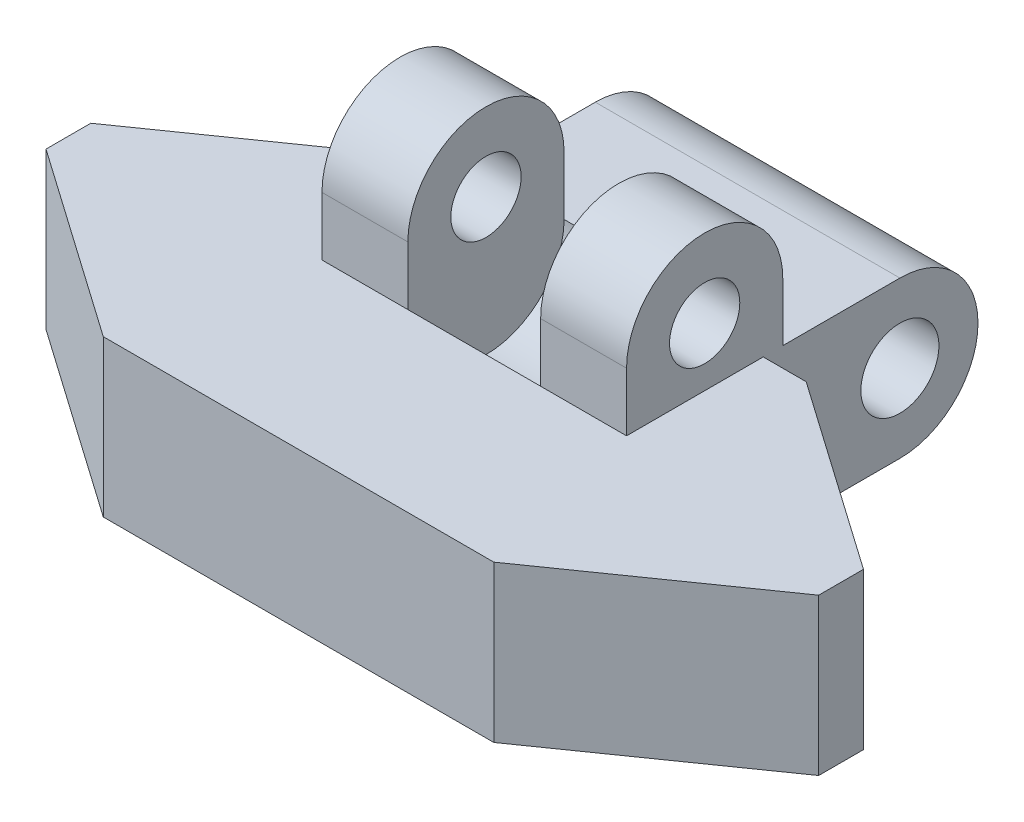
ISO-10303-21;
HEADER;
FILE_DESCRIPTION(('STEP AP214'),'2;1');
FILE_NAME('part.step','',(''),(''),'','','');
FILE_SCHEMA(('AUTOMOTIVE_DESIGN { 1 0 10303 214 1 1 1 1 }'));
ENDSEC;
DATA;
#1=APPLICATION_CONTEXT('core data for automotive mechanical design processes');
#2=APPLICATION_PROTOCOL_DEFINITION('international standard','automotive_design',2000,#1);
#3=PRODUCT_CONTEXT('',#1,'mechanical');
#4=PRODUCT('Part','Part','',(#3));
#5=PRODUCT_RELATED_PRODUCT_CATEGORY('part','',(#4));
#6=PRODUCT_DEFINITION_FORMATION('','',#4);
#7=PRODUCT_DEFINITION_CONTEXT('part definition',#1,'design');
#8=PRODUCT_DEFINITION('design','',#6,#7);
#9=PRODUCT_DEFINITION_SHAPE('','',#8);
#10=(LENGTH_UNIT() NAMED_UNIT(*) SI_UNIT(.MILLI.,.METRE.));
#11=(NAMED_UNIT(*) PLANE_ANGLE_UNIT() SI_UNIT($,.RADIAN.));
#12=(NAMED_UNIT(*) SI_UNIT($,.STERADIAN.) SOLID_ANGLE_UNIT());
#13=UNCERTAINTY_MEASURE_WITH_UNIT(LENGTH_MEASURE(1.E-05),#10,'distance_accuracy_value','');
#14=(GEOMETRIC_REPRESENTATION_CONTEXT(3) GLOBAL_UNCERTAINTY_ASSIGNED_CONTEXT((#13)) GLOBAL_UNIT_ASSIGNED_CONTEXT((#10,
#11,#12)) REPRESENTATION_CONTEXT('',''));
#15=CARTESIAN_POINT('',(0.,0.,0.));
#16=DIRECTION('',(0.,0.,1.));
#17=DIRECTION('',(1.,0.,0.));
#18=AXIS2_PLACEMENT_3D('',#15,#16,#17);
#19=CARTESIAN_POINT('',(0.,4.,0.));
#20=DIRECTION('',(0.,1.,0.));
#21=DIRECTION('',(0.,0.,1.));
#22=AXIS2_PLACEMENT_3D('',#19,#20,#21);
#23=PLANE('',#22);
#24=DIRECTION('',(1.,0.,0.));
#25=VECTOR('',#24,1.);
#26=CARTESIAN_POINT('',(-3.9,4.,-0.500000000000001));
#27=LINE('',#26,#25);
#28=CARTESIAN_POINT('',(1.7,4.,-0.500000000000001));
#29=VERTEX_POINT('',#28);
#30=CARTESIAN_POINT('',(3.9,4.,-0.500000000000001));
#31=VERTEX_POINT('',#30);
#32=EDGE_CURVE('E239',#29,#31,#27,.T.);
#33=ORIENTED_EDGE('',*,*,#32,.F.);
#34=DIRECTION('',(1.,0.,0.));
#35=VECTOR('',#34,1.);
#36=CARTESIAN_POINT('',(-6.17213595499958,4.,-0.5));
#37=LINE('',#36,#35);
#38=CARTESIAN_POINT('',(-1.7,4.,-0.5));
#39=VERTEX_POINT('',#38);
#40=EDGE_CURVE('E308',#39,#29,#37,.T.);
#41=ORIENTED_EDGE('',*,*,#40,.F.);
#42=CARTESIAN_POINT('',(-3.9,4.,-0.500000000000001));
#43=VERTEX_POINT('',#42);
#44=EDGE_CURVE('E235',#43,#39,#27,.T.);
#45=ORIENTED_EDGE('',*,*,#44,.F.);
#46=DIRECTION('',(0.,0.,-1.));
#47=VECTOR('',#46,1.);
#48=CARTESIAN_POINT('',(-3.9,4.,-0.500000000000001));
#49=LINE('',#48,#47);
#50=CARTESIAN_POINT('',(-3.9,4.,-4.));
#51=VERTEX_POINT('',#50);
#52=EDGE_CURVE('E256',#43,#51,#49,.T.);
#53=ORIENTED_EDGE('',*,*,#52,.T.);
#54=DIRECTION('',(-1.,0.,0.));
#55=VECTOR('',#54,1.);
#56=CARTESIAN_POINT('',(-5.,4.,-4.));
#57=LINE('',#56,#55);
#58=CARTESIAN_POINT('',(-5.,4.,-4.));
#59=VERTEX_POINT('',#58);
#60=EDGE_CURVE('E63',#51,#59,#57,.T.);
#61=ORIENTED_EDGE('',*,*,#60,.T.);
#62=DIRECTION('',(-0.819152044288995,0.,0.573576436351041));
#63=VECTOR('',#62,1.);
#64=CARTESIAN_POINT('',(-9.89343998267953,4.,-0.573576436351043));
#65=LINE('',#64,#63);
#66=CARTESIAN_POINT('',(-9.89343998267953,4.,-0.573576436351043));
#67=VERTEX_POINT('',#66);
#68=EDGE_CURVE('E169',#59,#67,#65,.T.);
#69=ORIENTED_EDGE('',*,*,#68,.T.);
#70=DIRECTION('',(0.,0.,1.));
#71=VECTOR('',#70,1.);
#72=CARTESIAN_POINT('',(-9.89343998267953,4.,0.573576436351038));
#73=LINE('',#72,#71);
#74=CARTESIAN_POINT('',(-9.89343998267953,4.,0.573576436351038));
#75=VERTEX_POINT('',#74);
#76=EDGE_CURVE('E104',#67,#75,#73,.T.);
#77=ORIENTED_EDGE('',*,*,#76,.T.);
#78=DIRECTION('',(0.819152044288995,0.,0.573576436351041));
#79=VECTOR('',#78,1.);
#80=CARTESIAN_POINT('',(-9.89343998267953,4.,0.573576436351038));
#81=LINE('',#80,#79);
#82=CARTESIAN_POINT('',(-5.,4.,4.));
#83=VERTEX_POINT('',#82);
#84=EDGE_CURVE('E184',#75,#83,#81,.T.);
#85=ORIENTED_EDGE('',*,*,#84,.T.);
#86=DIRECTION('',(1.,0.,0.));
#87=VECTOR('',#86,1.);
#88=CARTESIAN_POINT('',(-5.,4.,4.));
#89=LINE('',#88,#87);
#90=CARTESIAN_POINT('',(5.,4.,4.));
#91=VERTEX_POINT('',#90);
#92=EDGE_CURVE('E196',#83,#91,#89,.T.);
#93=ORIENTED_EDGE('',*,*,#92,.T.);
#94=DIRECTION('',(0.819152044288995,0.,-0.573576436351041));
#95=VECTOR('',#94,1.);
#96=CARTESIAN_POINT('',(9.89343998267953,4.,0.573576436351038));
#97=LINE('',#96,#95);
#98=CARTESIAN_POINT('',(9.89343998267953,4.,0.573576436351038));
#99=VERTEX_POINT('',#98);
#100=EDGE_CURVE('E127',#91,#99,#97,.T.);
#101=ORIENTED_EDGE('',*,*,#100,.T.);
#102=DIRECTION('',(0.,0.,-1.));
#103=VECTOR('',#102,1.);
#104=CARTESIAN_POINT('',(9.89343998267953,4.,-0.573576436351043));
#105=LINE('',#104,#103);
#106=CARTESIAN_POINT('',(9.89343998267953,4.,-0.573576436351043));
#107=VERTEX_POINT('',#106);
#108=EDGE_CURVE('E119',#99,#107,#105,.T.);
#109=ORIENTED_EDGE('',*,*,#108,.T.);
#110=DIRECTION('',(-0.819152044288995,0.,-0.573576436351041));
#111=VECTOR('',#110,1.);
#112=CARTESIAN_POINT('',(9.89343998267953,4.,-0.573576436351043));
#113=LINE('',#112,#111);
#114=CARTESIAN_POINT('',(5.,4.,-4.));
#115=VERTEX_POINT('',#114);
#116=EDGE_CURVE('E124',#107,#115,#113,.T.);
#117=ORIENTED_EDGE('',*,*,#116,.T.);
#118=CARTESIAN_POINT('',(3.9,4.,-4.));
#119=VERTEX_POINT('',#118);
#120=EDGE_CURVE('E146',#115,#119,#57,.T.);
#121=ORIENTED_EDGE('',*,*,#120,.T.);
#122=DIRECTION('',(0.,0.,-1.));
#123=VECTOR('',#122,1.);
#124=CARTESIAN_POINT('',(3.9,4.,-0.500000000000001));
#125=LINE('',#124,#123);
#126=EDGE_CURVE('E270',#31,#119,#125,.T.);
#127=ORIENTED_EDGE('',*,*,#126,.F.);
#128=EDGE_LOOP('',(#33,#41,#45,#53,#61,#69,#77,#85,#93,#101,#109,#117,#121,#127));
#129=FACE_BOUND('',#128,.T.);
#130=ADVANCED_FACE('F39',(#129),#23,.T.);
#131=DIRECTION('',(1.,0.,0.));
#132=VECTOR('',#131,1.);
#133=CARTESIAN_POINT('',(-3.9,4.,-4.5));
#134=LINE('',#133,#132);
#135=CARTESIAN_POINT('',(-3.9,4.,-4.5));
#136=VERTEX_POINT('',#135);
#137=CARTESIAN_POINT('',(-1.7,4.,-4.5));
#138=VERTEX_POINT('',#137);
#139=EDGE_CURVE('E240',#136,#138,#134,.T.);
#140=ORIENTED_EDGE('',*,*,#139,.T.);
#141=DIRECTION('',(1.,0.,0.));
#142=VECTOR('',#141,1.);
#143=CARTESIAN_POINT('',(-6.17213595499958,4.,-4.5));
#144=LINE('',#143,#142);
#145=CARTESIAN_POINT('',(1.7,4.,-4.5));
#146=VERTEX_POINT('',#145);
#147=EDGE_CURVE('E304',#138,#146,#144,.T.);
#148=ORIENTED_EDGE('',*,*,#147,.T.);
#149=CARTESIAN_POINT('',(3.9,4.,-4.5));
#150=VERTEX_POINT('',#149);
#151=EDGE_CURVE('E238',#146,#150,#134,.T.);
#152=ORIENTED_EDGE('',*,*,#151,.T.);
#153=DIRECTION('',(0.,0.,1.));
#154=VECTOR('',#153,1.);
#155=CARTESIAN_POINT('',(3.9,4.,-4.));
#156=LINE('',#155,#154);
#157=CARTESIAN_POINT('',(3.9,4.,-7.5));
#158=VERTEX_POINT('',#157);
#159=EDGE_CURVE('E219',#158,#150,#156,.T.);
#160=ORIENTED_EDGE('',*,*,#159,.F.);
#161=DIRECTION('',(1.,0.,0.));
#162=VECTOR('',#161,1.);
#163=CARTESIAN_POINT('',(-3.9,4.,-7.5));
#164=LINE('',#163,#162);
#165=CARTESIAN_POINT('',(-3.9,4.,-7.5));
#166=VERTEX_POINT('',#165);
#167=EDGE_CURVE('E155',#166,#158,#164,.T.);
#168=ORIENTED_EDGE('',*,*,#167,.F.);
#169=DIRECTION('',(0.,0.,1.));
#170=VECTOR('',#169,1.);
#171=CARTESIAN_POINT('',(-3.9,4.,-4.));
#172=LINE('',#171,#170);
#173=EDGE_CURVE('E205',#166,#136,#172,.T.);
#174=ORIENTED_EDGE('',*,*,#173,.T.);
#175=EDGE_LOOP('',(#140,#148,#152,#160,#168,#174));
#176=FACE_BOUND('',#175,.T.);
#177=ADVANCED_FACE('F371',(#176),#23,.T.);
#178=CARTESIAN_POINT('',(-3.9,4.,-0.500000000000001));
#179=DIRECTION('',(0.,0.,1.));
#180=DIRECTION('',(1.,0.,0.));
#181=AXIS2_PLACEMENT_3D('',#178,#179,#180);
#182=PLANE('',#181);
#183=DIRECTION('',(0.,1.,0.));
#184=VECTOR('',#183,1.);
#185=CARTESIAN_POINT('',(-1.7,7.5,-0.5));
#186=LINE('',#185,#184);
#187=CARTESIAN_POINT('',(-1.7,5.5,-0.500000000000001));
#188=VERTEX_POINT('',#187);
#189=EDGE_CURVE('E289',#39,#188,#186,.T.);
#190=ORIENTED_EDGE('',*,*,#189,.T.);
#191=DIRECTION('',(1.,0.,0.));
#192=VECTOR('',#191,1.);
#193=CARTESIAN_POINT('',(-3.9,5.5,-0.500000000000001));
#194=LINE('',#193,#192);
#195=CARTESIAN_POINT('',(-3.9,5.5,-0.500000000000001));
#196=VERTEX_POINT('',#195);
#197=EDGE_CURVE('E234',#196,#188,#194,.T.);
#198=ORIENTED_EDGE('',*,*,#197,.F.);
#199=DIRECTION('',(0.,-1.,0.));
#200=VECTOR('',#199,1.);
#201=CARTESIAN_POINT('',(-3.9,4.,-0.500000000000001));
#202=LINE('',#201,#200);
#203=EDGE_CURVE('E258',#196,#43,#202,.T.);
#204=ORIENTED_EDGE('',*,*,#203,.T.);
#205=ORIENTED_EDGE('',*,*,#44,.T.);
#206=EDGE_LOOP('',(#190,#198,#204,#205));
#207=FACE_BOUND('',#206,.T.);
#208=ADVANCED_FACE('F412',(#207),#182,.T.);
#209=CARTESIAN_POINT('',(-3.9,5.5,-2.5));
#210=DIRECTION('',(1.,0.,0.));
#211=DIRECTION('',(0.,0.,-1.));
#212=AXIS2_PLACEMENT_3D('',#209,#210,#211);
#213=CYLINDRICAL_SURFACE('',#212,2.);
#214=CARTESIAN_POINT('',(-1.7,5.5,-2.5));
#215=DIRECTION('',(-1.,0.,0.));
#216=DIRECTION('',(0.,0.,1.));
#217=AXIS2_PLACEMENT_3D('',#214,#215,#216);
#218=CIRCLE('',#217,2.);
#219=CARTESIAN_POINT('',(-1.7,5.5,-4.5));
#220=VERTEX_POINT('',#219);
#221=EDGE_CURVE('E286',#188,#220,#218,.T.);
#222=ORIENTED_EDGE('',*,*,#221,.T.);
#223=DIRECTION('',(1.,0.,0.));
#224=VECTOR('',#223,1.);
#225=CARTESIAN_POINT('',(-3.9,5.5,-4.5));
#226=LINE('',#225,#224);
#227=CARTESIAN_POINT('',(-3.9,5.5,-4.5));
#228=VERTEX_POINT('',#227);
#229=EDGE_CURVE('E244',#228,#220,#226,.T.);
#230=ORIENTED_EDGE('',*,*,#229,.F.);
#231=CARTESIAN_POINT('',(-3.9,5.5,-2.5));
#232=DIRECTION('',(1.,0.,0.));
#233=DIRECTION('',(0.,0.,-1.));
#234=AXIS2_PLACEMENT_3D('',#231,#232,#233);
#235=CIRCLE('',#234,2.);
#236=EDGE_CURVE('E250',#228,#196,#235,.T.);
#237=ORIENTED_EDGE('',*,*,#236,.T.);
#238=ORIENTED_EDGE('',*,*,#197,.T.);
#239=EDGE_LOOP('',(#222,#230,#237,#238));
#240=FACE_BOUND('',#239,.T.);
#241=ADVANCED_FACE('F410',(#240),#213,.T.);
#242=CARTESIAN_POINT('',(-3.9,4.,-4.5));
#243=DIRECTION('',(0.,0.,-1.));
#244=DIRECTION('',(-1.,0.,0.));
#245=AXIS2_PLACEMENT_3D('',#242,#243,#244);
#246=PLANE('',#245);
#247=DIRECTION('',(0.,-1.,0.));
#248=VECTOR('',#247,1.);
#249=CARTESIAN_POINT('',(-1.7,7.5,-4.5));
#250=LINE('',#249,#248);
#251=EDGE_CURVE('E297',#220,#138,#250,.T.);
#252=ORIENTED_EDGE('',*,*,#251,.T.);
#253=ORIENTED_EDGE('',*,*,#139,.F.);
#254=DIRECTION('',(0.,1.,0.));
#255=VECTOR('',#254,1.);
#256=CARTESIAN_POINT('',(-3.9,4.,-4.5));
#257=LINE('',#256,#255);
#258=EDGE_CURVE('E253',#136,#228,#257,.T.);
#259=ORIENTED_EDGE('',*,*,#258,.T.);
#260=ORIENTED_EDGE('',*,*,#229,.T.);
#261=EDGE_LOOP('',(#252,#253,#259,#260));
#262=FACE_BOUND('',#261,.T.);
#263=ADVANCED_FACE('F406',(#262),#246,.T.);
#264=CARTESIAN_POINT('',(-3.9,5.5,-2.5));
#265=DIRECTION('',(1.,0.,0.));
#266=DIRECTION('',(0.,0.,-1.));
#267=AXIS2_PLACEMENT_3D('',#264,#265,#266);
#268=CYLINDRICAL_SURFACE('',#267,0.899999999999999);
#269=CARTESIAN_POINT('',(-1.7,5.5,-2.5));
#270=DIRECTION('',(-1.,0.,0.));
#271=DIRECTION('',(0.,0.,1.));
#272=AXIS2_PLACEMENT_3D('',#269,#270,#271);
#273=CIRCLE('',#272,0.899999999999999);
#274=CARTESIAN_POINT('',(-1.7,5.5,-1.6));
#275=VERTEX_POINT('',#274);
#276=EDGE_CURVE('E279',#275,#275,#273,.T.);
#277=ORIENTED_EDGE('',*,*,#276,.F.);
#278=EDGE_LOOP('',(#277));
#279=FACE_BOUND('',#278,.T.);
#280=CARTESIAN_POINT('',(-3.9,5.5,-2.5));
#281=DIRECTION('',(1.,0.,0.));
#282=DIRECTION('',(0.,0.,-1.));
#283=AXIS2_PLACEMENT_3D('',#280,#281,#282);
#284=CIRCLE('',#283,0.899999999999999);
#285=CARTESIAN_POINT('',(-3.9,5.5,-3.4));
#286=VERTEX_POINT('',#285);
#287=EDGE_CURVE('E261',#286,#286,#284,.T.);
#288=ORIENTED_EDGE('',*,*,#287,.F.);
#289=EDGE_LOOP('',(#288));
#290=FACE_BOUND('',#289,.T.);
#291=ADVANCED_FACE('F495',(#279,#290),#268,.F.);
#292=CARTESIAN_POINT('',(-5.,4.,-4.));
#293=DIRECTION('',(0.,0.,1.));
#294=DIRECTION('',(1.,0.,0.));
#295=AXIS2_PLACEMENT_3D('',#292,#293,#294);
#296=PLANE('',#295);
#297=DIRECTION('',(0.,-1.,0.));
#298=VECTOR('',#297,1.);
#299=CARTESIAN_POINT('',(3.9,4.,-4.));
#300=LINE('',#299,#298);
#301=CARTESIAN_POINT('',(3.9,0.,-4.));
#302=VERTEX_POINT('',#301);
#303=EDGE_CURVE('E228',#119,#302,#300,.T.);
#304=ORIENTED_EDGE('',*,*,#303,.F.);
#305=ORIENTED_EDGE('',*,*,#120,.F.);
#306=DIRECTION('',(0.,-1.,0.));
#307=VECTOR('',#306,1.);
#308=CARTESIAN_POINT('',(5.,4.,-4.));
#309=LINE('',#308,#307);
#310=CARTESIAN_POINT('',(5.,0.,-4.));
#311=VERTEX_POINT('',#310);
#312=EDGE_CURVE('E140',#115,#311,#309,.T.);
#313=ORIENTED_EDGE('',*,*,#312,.T.);
#314=DIRECTION('',(-1.,0.,0.));
#315=VECTOR('',#314,1.);
#316=CARTESIAN_POINT('',(-5.,0.,-4.));
#317=LINE('',#316,#315);
#318=EDGE_CURVE('E166',#311,#302,#317,.T.);
#319=ORIENTED_EDGE('',*,*,#318,.T.);
#320=EDGE_LOOP('',(#304,#305,#313,#319));
#321=FACE_BOUND('',#320,.T.);
#322=ADVANCED_FACE('F355',(#321),#296,.F.);
#323=CARTESIAN_POINT('',(-9.89343998267953,4.,-0.573576436351043));
#324=DIRECTION('',(0.573576436351041,0.,0.819152044288995));
#325=DIRECTION('',(0.819152044288995,0.,-0.573576436351041));
#326=AXIS2_PLACEMENT_3D('',#323,#324,#325);
#327=PLANE('',#326);
#328=DIRECTION('',(-0.819152044288995,0.,0.573576436351041));
#329=VECTOR('',#328,1.);
#330=CARTESIAN_POINT('',(-9.89343998267953,0.,-0.573576436351043));
#331=LINE('',#330,#329);
#332=CARTESIAN_POINT('',(-5.,0.,-4.));
#333=VERTEX_POINT('',#332);
#334=CARTESIAN_POINT('',(-9.89343998267953,0.,-0.573576436351043));
#335=VERTEX_POINT('',#334);
#336=EDGE_CURVE('E151',#333,#335,#331,.T.);
#337=ORIENTED_EDGE('',*,*,#336,.T.);
#338=DIRECTION('',(0.,-1.,0.));
#339=VECTOR('',#338,1.);
#340=CARTESIAN_POINT('',(-9.89343998267953,4.,-0.573576436351043));
#341=LINE('',#340,#339);
#342=EDGE_CURVE('E11',#67,#335,#341,.T.);
#343=ORIENTED_EDGE('',*,*,#342,.F.);
#344=ORIENTED_EDGE('',*,*,#68,.F.);
#345=DIRECTION('',(0.,-1.,0.));
#346=VECTOR('',#345,1.);
#347=CARTESIAN_POINT('',(-5.,4.,-4.));
#348=LINE('',#347,#346);
#349=EDGE_CURVE('E150',#59,#333,#348,.T.);
#350=ORIENTED_EDGE('',*,*,#349,.T.);
#351=EDGE_LOOP('',(#337,#343,#344,#350));
#352=FACE_BOUND('',#351,.T.);
#353=ADVANCED_FACE('F41',(#352),#327,.F.);
#354=CARTESIAN_POINT('',(-9.89343998267953,4.,0.573576436351038));
#355=DIRECTION('',(1.,0.,0.));
#356=DIRECTION('',(0.,0.,-1.));
#357=AXIS2_PLACEMENT_3D('',#354,#355,#356);
#358=PLANE('',#357);
#359=DIRECTION('',(0.,0.,1.));
#360=VECTOR('',#359,1.);
#361=CARTESIAN_POINT('',(-9.89343998267953,0.,0.573576436351038));
#362=LINE('',#361,#360);
#363=CARTESIAN_POINT('',(-9.89343998267953,0.,0.573576436351038));
#364=VERTEX_POINT('',#363);
#365=EDGE_CURVE('E154',#335,#364,#362,.T.);
#366=ORIENTED_EDGE('',*,*,#365,.T.);
#367=DIRECTION('',(0.,-1.,0.));
#368=VECTOR('',#367,1.);
#369=CARTESIAN_POINT('',(-9.89343998267953,4.,0.573576436351038));
#370=LINE('',#369,#368);
#371=EDGE_CURVE('E47',#75,#364,#370,.T.);
#372=ORIENTED_EDGE('',*,*,#371,.F.);
#373=ORIENTED_EDGE('',*,*,#76,.F.);
#374=ORIENTED_EDGE('',*,*,#342,.T.);
#375=EDGE_LOOP('',(#366,#372,#373,#374));
#376=FACE_BOUND('',#375,.T.);
#377=ADVANCED_FACE('F420',(#376),#358,.F.);
#378=CARTESIAN_POINT('',(-9.89343998267953,4.,0.573576436351038));
#379=DIRECTION('',(0.573576436351041,0.,-0.819152044288995));
#380=DIRECTION('',(-0.819152044288995,0.,-0.573576436351041));
#381=AXIS2_PLACEMENT_3D('',#378,#379,#380);
#382=PLANE('',#381);
#383=DIRECTION('',(0.819152044288995,0.,0.573576436351041));
#384=VECTOR('',#383,1.);
#385=CARTESIAN_POINT('',(-9.89343998267953,0.,0.573576436351038));
#386=LINE('',#385,#384);
#387=CARTESIAN_POINT('',(-5.,0.,4.));
#388=VERTEX_POINT('',#387);
#389=EDGE_CURVE('E157',#364,#388,#386,.T.);
#390=ORIENTED_EDGE('',*,*,#389,.T.);
#391=DIRECTION('',(0.,-1.,0.));
#392=VECTOR('',#391,1.);
#393=CARTESIAN_POINT('',(-5.,4.,4.));
#394=LINE('',#393,#392);
#395=EDGE_CURVE('E176',#83,#388,#394,.T.);
#396=ORIENTED_EDGE('',*,*,#395,.F.);
#397=ORIENTED_EDGE('',*,*,#84,.F.);
#398=ORIENTED_EDGE('',*,*,#371,.T.);
#399=EDGE_LOOP('',(#390,#396,#397,#398));
#400=FACE_BOUND('',#399,.T.);
#401=ADVANCED_FACE('F182',(#400),#382,.F.);
#402=CARTESIAN_POINT('',(-5.,4.,4.));
#403=DIRECTION('',(0.,0.,-1.));
#404=DIRECTION('',(-1.,0.,0.));
#405=AXIS2_PLACEMENT_3D('',#402,#403,#404);
#406=PLANE('',#405);
#407=DIRECTION('',(1.,0.,0.));
#408=VECTOR('',#407,1.);
#409=CARTESIAN_POINT('',(-5.,0.,4.));
#410=LINE('',#409,#408);
#411=CARTESIAN_POINT('',(5.,0.,4.));
#412=VERTEX_POINT('',#411);
#413=EDGE_CURVE('E159',#388,#412,#410,.T.);
#414=ORIENTED_EDGE('',*,*,#413,.T.);
#415=DIRECTION('',(0.,-1.,0.));
#416=VECTOR('',#415,1.);
#417=CARTESIAN_POINT('',(5.,4.,4.));
#418=LINE('',#417,#416);
#419=EDGE_CURVE('E173',#91,#412,#418,.T.);
#420=ORIENTED_EDGE('',*,*,#419,.F.);
#421=ORIENTED_EDGE('',*,*,#92,.F.);
#422=ORIENTED_EDGE('',*,*,#395,.T.);
#423=EDGE_LOOP('',(#414,#420,#421,#422));
#424=FACE_BOUND('',#423,.T.);
#425=ADVANCED_FACE('F192',(#424),#406,.F.);
#426=CARTESIAN_POINT('',(9.89343998267953,4.,0.573576436351038));
#427=DIRECTION('',(-0.573576436351041,0.,-0.819152044288995));
#428=DIRECTION('',(-0.819152044288995,0.,0.573576436351041));
#429=AXIS2_PLACEMENT_3D('',#426,#427,#428);
#430=PLANE('',#429);
#431=DIRECTION('',(0.819152044288995,0.,-0.573576436351041));
#432=VECTOR('',#431,1.);
#433=CARTESIAN_POINT('',(9.89343998267953,0.,0.573576436351038));
#434=LINE('',#433,#432);
#435=CARTESIAN_POINT('',(9.89343998267953,0.,0.573576436351038));
#436=VERTEX_POINT('',#435);
#437=EDGE_CURVE('E161',#412,#436,#434,.T.);
#438=ORIENTED_EDGE('',*,*,#437,.T.);
#439=DIRECTION('',(0.,-1.,0.));
#440=VECTOR('',#439,1.);
#441=CARTESIAN_POINT('',(9.89343998267953,4.,0.573576436351038));
#442=LINE('',#441,#440);
#443=EDGE_CURVE('E139',#99,#436,#442,.T.);
#444=ORIENTED_EDGE('',*,*,#443,.F.);
#445=ORIENTED_EDGE('',*,*,#100,.F.);
#446=ORIENTED_EDGE('',*,*,#419,.T.);
#447=EDGE_LOOP('',(#438,#444,#445,#446));
#448=FACE_BOUND('',#447,.T.);
#449=ADVANCED_FACE('F195',(#448),#430,.F.);
#450=CARTESIAN_POINT('',(9.89343998267953,4.,-0.573576436351043));
#451=DIRECTION('',(-1.,0.,0.));
#452=DIRECTION('',(0.,0.,1.));
#453=AXIS2_PLACEMENT_3D('',#450,#451,#452);
#454=PLANE('',#453);
#455=DIRECTION('',(0.,0.,-1.));
#456=VECTOR('',#455,1.);
#457=CARTESIAN_POINT('',(9.89343998267953,0.,-0.573576436351043));
#458=LINE('',#457,#456);
#459=CARTESIAN_POINT('',(9.89343998267953,0.,-0.573576436351043));
#460=VERTEX_POINT('',#459);
#461=EDGE_CURVE('E136',#436,#460,#458,.T.);
#462=ORIENTED_EDGE('',*,*,#461,.T.);
#463=DIRECTION('',(0.,-1.,0.));
#464=VECTOR('',#463,1.);
#465=CARTESIAN_POINT('',(9.89343998267953,4.,-0.573576436351043));
#466=LINE('',#465,#464);
#467=EDGE_CURVE('E133',#107,#460,#466,.T.);
#468=ORIENTED_EDGE('',*,*,#467,.F.);
#469=ORIENTED_EDGE('',*,*,#108,.F.);
#470=ORIENTED_EDGE('',*,*,#443,.T.);
#471=EDGE_LOOP('',(#462,#468,#469,#470));
#472=FACE_BOUND('',#471,.T.);
#473=ADVANCED_FACE('F134',(#472),#454,.F.);
#474=CARTESIAN_POINT('',(9.89343998267953,4.,-0.573576436351043));
#475=DIRECTION('',(-0.573576436351041,0.,0.819152044288995));
#476=DIRECTION('',(0.819152044288995,0.,0.573576436351041));
#477=AXIS2_PLACEMENT_3D('',#474,#475,#476);
#478=PLANE('',#477);
#479=DIRECTION('',(-0.819152044288995,0.,-0.573576436351041));
#480=VECTOR('',#479,1.);
#481=CARTESIAN_POINT('',(9.89343998267953,0.,-0.573576436351043));
#482=LINE('',#481,#480);
#483=EDGE_CURVE('E164',#460,#311,#482,.T.);
#484=ORIENTED_EDGE('',*,*,#483,.T.);
#485=ORIENTED_EDGE('',*,*,#312,.F.);
#486=ORIENTED_EDGE('',*,*,#116,.F.);
#487=ORIENTED_EDGE('',*,*,#467,.T.);
#488=EDGE_LOOP('',(#484,#485,#486,#487));
#489=FACE_BOUND('',#488,.T.);
#490=ADVANCED_FACE('F142',(#489),#478,.F.);
#491=ORIENTED_EDGE('',*,*,#60,.F.);
#492=DIRECTION('',(0.,-1.,0.));
#493=VECTOR('',#492,1.);
#494=CARTESIAN_POINT('',(-3.9,4.,-4.));
#495=LINE('',#494,#493);
#496=CARTESIAN_POINT('',(-3.9,0.,-4.));
#497=VERTEX_POINT('',#496);
#498=EDGE_CURVE('E214',#51,#497,#495,.T.);
#499=ORIENTED_EDGE('',*,*,#498,.T.);
#500=EDGE_CURVE('E96',#497,#333,#317,.T.);
#501=ORIENTED_EDGE('',*,*,#500,.T.);
#502=ORIENTED_EDGE('',*,*,#349,.F.);
#503=EDGE_LOOP('',(#491,#499,#501,#502));
#504=FACE_BOUND('',#503,.T.);
#505=ADVANCED_FACE('F416',(#504),#296,.F.);
#506=CARTESIAN_POINT('',(0.,0.,0.));
#507=DIRECTION('',(0.,1.,0.));
#508=DIRECTION('',(0.,0.,1.));
#509=AXIS2_PLACEMENT_3D('',#506,#507,#508);
#510=PLANE('',#509);
#511=ORIENTED_EDGE('',*,*,#336,.F.);
#512=ORIENTED_EDGE('',*,*,#500,.F.);
#513=DIRECTION('',(0.,0.,-1.));
#514=VECTOR('',#513,1.);
#515=CARTESIAN_POINT('',(-3.9,0.,-4.));
#516=LINE('',#515,#514);
#517=CARTESIAN_POINT('',(-3.9,0.,-7.5));
#518=VERTEX_POINT('',#517);
#519=EDGE_CURVE('E54',#497,#518,#516,.T.);
#520=ORIENTED_EDGE('',*,*,#519,.T.);
#521=DIRECTION('',(1.,0.,0.));
#522=VECTOR('',#521,1.);
#523=CARTESIAN_POINT('',(-3.9,0.,-7.5));
#524=LINE('',#523,#522);
#525=CARTESIAN_POINT('',(3.9,0.,-7.5));
#526=VERTEX_POINT('',#525);
#527=EDGE_CURVE('E202',#518,#526,#524,.T.);
#528=ORIENTED_EDGE('',*,*,#527,.T.);
#529=DIRECTION('',(0.,0.,-1.));
#530=VECTOR('',#529,1.);
#531=CARTESIAN_POINT('',(3.9,0.,-4.));
#532=LINE('',#531,#530);
#533=EDGE_CURVE('E225',#302,#526,#532,.T.);
#534=ORIENTED_EDGE('',*,*,#533,.F.);
#535=ORIENTED_EDGE('',*,*,#318,.F.);
#536=ORIENTED_EDGE('',*,*,#483,.F.);
#537=ORIENTED_EDGE('',*,*,#461,.F.);
#538=ORIENTED_EDGE('',*,*,#437,.F.);
#539=ORIENTED_EDGE('',*,*,#413,.F.);
#540=ORIENTED_EDGE('',*,*,#389,.F.);
#541=ORIENTED_EDGE('',*,*,#365,.F.);
#542=EDGE_LOOP('',(#511,#512,#520,#528,#534,#535,#536,#537,#538,#539,#540,#541));
#543=FACE_BOUND('',#542,.T.);
#544=ADVANCED_FACE('F188',(#543),#510,.F.);
#545=CARTESIAN_POINT('',(-3.9,2.,-7.5));
#546=DIRECTION('',(1.,0.,0.));
#547=DIRECTION('',(0.,0.,-1.));
#548=AXIS2_PLACEMENT_3D('',#545,#546,#547);
#549=CYLINDRICAL_SURFACE('',#548,2.);
#550=ORIENTED_EDGE('',*,*,#167,.T.);
#551=CARTESIAN_POINT('',(3.9,2.,-7.5));
#552=DIRECTION('',(1.,0.,0.));
#553=DIRECTION('',(0.,0.,-1.));
#554=AXIS2_PLACEMENT_3D('',#551,#552,#553);
#555=CIRCLE('',#554,2.);
#556=EDGE_CURVE('E222',#526,#158,#555,.T.);
#557=ORIENTED_EDGE('',*,*,#556,.F.);
#558=ORIENTED_EDGE('',*,*,#527,.F.);
#559=CARTESIAN_POINT('',(-3.9,2.,-7.5));
#560=DIRECTION('',(1.,0.,0.));
#561=DIRECTION('',(0.,0.,-1.));
#562=AXIS2_PLACEMENT_3D('',#559,#560,#561);
#563=CIRCLE('',#562,2.);
#564=EDGE_CURVE('E210',#518,#166,#563,.T.);
#565=ORIENTED_EDGE('',*,*,#564,.T.);
#566=EDGE_LOOP('',(#550,#557,#558,#565));
#567=FACE_BOUND('',#566,.T.);
#568=ADVANCED_FACE('F366',(#567),#549,.T.);
#569=CARTESIAN_POINT('',(-3.9,2.,-7.5));
#570=DIRECTION('',(1.,0.,0.));
#571=DIRECTION('',(0.,0.,-1.));
#572=AXIS2_PLACEMENT_3D('',#569,#570,#571);
#573=PLANE('',#572);
#574=CARTESIAN_POINT('',(-3.9,2.,-7.5));
#575=DIRECTION('',(1.,0.,0.));
#576=DIRECTION('',(0.,0.,-1.));
#577=AXIS2_PLACEMENT_3D('',#574,#575,#576);
#578=CIRCLE('',#577,1.);
#579=CARTESIAN_POINT('',(-3.9,2.,-8.5));
#580=VERTEX_POINT('',#579);
#581=EDGE_CURVE('E216',#580,#580,#578,.T.);
#582=ORIENTED_EDGE('',*,*,#581,.T.);
#583=EDGE_LOOP('',(#582));
#584=FACE_BOUND('',#583,.T.);
#585=ORIENTED_EDGE('',*,*,#498,.F.);
#586=ORIENTED_EDGE('',*,*,#52,.F.);
#587=ORIENTED_EDGE('',*,*,#203,.F.);
#588=ORIENTED_EDGE('',*,*,#236,.F.);
#589=ORIENTED_EDGE('',*,*,#258,.F.);
#590=ORIENTED_EDGE('',*,*,#173,.F.);
#591=ORIENTED_EDGE('',*,*,#564,.F.);
#592=ORIENTED_EDGE('',*,*,#519,.F.);
#593=EDGE_LOOP('',(#585,#586,#587,#588,#589,#590,#591,#592));
#594=FACE_BOUND('',#593,.T.);
#595=ORIENTED_EDGE('',*,*,#287,.T.);
#596=EDGE_LOOP('',(#595));
#597=FACE_BOUND('',#596,.T.);
#598=ADVANCED_FACE('F414',(#584,#594,#597),#573,.F.);
#599=CARTESIAN_POINT('',(-3.9,2.,-7.5));
#600=DIRECTION('',(1.,0.,0.));
#601=DIRECTION('',(0.,0.,-1.));
#602=AXIS2_PLACEMENT_3D('',#599,#600,#601);
#603=CYLINDRICAL_SURFACE('',#602,1.);
#604=ORIENTED_EDGE('',*,*,#581,.F.);
#605=EDGE_LOOP('',(#604));
#606=FACE_BOUND('',#605,.T.);
#607=CARTESIAN_POINT('',(3.9,2.,-7.5));
#608=DIRECTION('',(1.,0.,0.));
#609=DIRECTION('',(0.,0.,-1.));
#610=AXIS2_PLACEMENT_3D('',#607,#608,#609);
#611=CIRCLE('',#610,1.);
#612=CARTESIAN_POINT('',(3.9,2.,-8.5));
#613=VERTEX_POINT('',#612);
#614=EDGE_CURVE('E231',#613,#613,#611,.T.);
#615=ORIENTED_EDGE('',*,*,#614,.T.);
#616=EDGE_LOOP('',(#615));
#617=FACE_BOUND('',#616,.T.);
#618=ADVANCED_FACE('F484',(#606,#617),#603,.F.);
#619=CARTESIAN_POINT('',(3.9,2.,-7.5));
#620=DIRECTION('',(1.,0.,0.));
#621=DIRECTION('',(0.,0.,-1.));
#622=AXIS2_PLACEMENT_3D('',#619,#620,#621);
#623=PLANE('',#622);
#624=ORIENTED_EDGE('',*,*,#303,.T.);
#625=ORIENTED_EDGE('',*,*,#533,.T.);
#626=ORIENTED_EDGE('',*,*,#556,.T.);
#627=ORIENTED_EDGE('',*,*,#159,.T.);
#628=DIRECTION('',(0.,1.,0.));
#629=VECTOR('',#628,1.);
#630=CARTESIAN_POINT('',(3.9,4.,-4.5));
#631=LINE('',#630,#629);
#632=CARTESIAN_POINT('',(3.9,5.5,-4.5));
#633=VERTEX_POINT('',#632);
#634=EDGE_CURVE('E267',#150,#633,#631,.T.);
#635=ORIENTED_EDGE('',*,*,#634,.T.);
#636=CARTESIAN_POINT('',(3.9,5.5,-2.5));
#637=DIRECTION('',(1.,0.,0.));
#638=DIRECTION('',(0.,0.,-1.));
#639=AXIS2_PLACEMENT_3D('',#636,#637,#638);
#640=CIRCLE('',#639,2.);
#641=CARTESIAN_POINT('',(3.9,5.5,-0.500000000000001));
#642=VERTEX_POINT('',#641);
#643=EDGE_CURVE('E264',#633,#642,#640,.T.);
#644=ORIENTED_EDGE('',*,*,#643,.T.);
#645=DIRECTION('',(0.,-1.,0.));
#646=VECTOR('',#645,1.);
#647=CARTESIAN_POINT('',(3.9,4.,-0.500000000000001));
#648=LINE('',#647,#646);
#649=EDGE_CURVE('E273',#642,#31,#648,.T.);
#650=ORIENTED_EDGE('',*,*,#649,.T.);
#651=ORIENTED_EDGE('',*,*,#126,.T.);
#652=EDGE_LOOP('',(#624,#625,#626,#627,#635,#644,#650,#651));
#653=FACE_BOUND('',#652,.T.);
#654=ORIENTED_EDGE('',*,*,#614,.F.);
#655=EDGE_LOOP('',(#654));
#656=FACE_BOUND('',#655,.T.);
#657=CARTESIAN_POINT('',(3.9,5.5,-2.5));
#658=DIRECTION('',(1.,0.,0.));
#659=DIRECTION('',(0.,0.,-1.));
#660=AXIS2_PLACEMENT_3D('',#657,#658,#659);
#661=CIRCLE('',#660,0.899999999999999);
#662=CARTESIAN_POINT('',(3.9,5.5,-3.4));
#663=VERTEX_POINT('',#662);
#664=EDGE_CURVE('E276',#663,#663,#661,.T.);
#665=ORIENTED_EDGE('',*,*,#664,.F.);
#666=EDGE_LOOP('',(#665));
#667=FACE_BOUND('',#666,.T.);
#668=ADVANCED_FACE('F348',(#653,#656,#667),#623,.T.);
#669=DIRECTION('',(0.,-1.,0.));
#670=VECTOR('',#669,1.);
#671=CARTESIAN_POINT('',(1.7,7.5,-0.5));
#672=LINE('',#671,#670);
#673=CARTESIAN_POINT('',(1.7,5.5,-0.500000000000001));
#674=VERTEX_POINT('',#673);
#675=EDGE_CURVE('E294',#674,#29,#672,.T.);
#676=ORIENTED_EDGE('',*,*,#675,.T.);
#677=ORIENTED_EDGE('',*,*,#32,.T.);
#678=ORIENTED_EDGE('',*,*,#649,.F.);
#679=EDGE_CURVE('E247',#674,#642,#194,.T.);
#680=ORIENTED_EDGE('',*,*,#679,.F.);
#681=EDGE_LOOP('',(#676,#677,#678,#680));
#682=FACE_BOUND('',#681,.T.);
#683=ADVANCED_FACE('F338',(#682),#182,.T.);
#684=CARTESIAN_POINT('',(1.7,5.5,-2.5));
#685=DIRECTION('',(1.,0.,0.));
#686=DIRECTION('',(0.,0.,-1.));
#687=AXIS2_PLACEMENT_3D('',#684,#685,#686);
#688=CIRCLE('',#687,2.);
#689=CARTESIAN_POINT('',(1.7,5.5,-4.5));
#690=VERTEX_POINT('',#689);
#691=EDGE_CURVE('E280',#690,#674,#688,.T.);
#692=ORIENTED_EDGE('',*,*,#691,.T.);
#693=ORIENTED_EDGE('',*,*,#679,.T.);
#694=ORIENTED_EDGE('',*,*,#643,.F.);
#695=EDGE_CURVE('E243',#690,#633,#226,.T.);
#696=ORIENTED_EDGE('',*,*,#695,.F.);
#697=EDGE_LOOP('',(#692,#693,#694,#696));
#698=FACE_BOUND('',#697,.T.);
#699=ADVANCED_FACE('F521',(#698),#213,.T.);
#700=DIRECTION('',(0.,1.,0.));
#701=VECTOR('',#700,1.);
#702=CARTESIAN_POINT('',(1.7,7.5,-4.5));
#703=LINE('',#702,#701);
#704=EDGE_CURVE('E300',#146,#690,#703,.T.);
#705=ORIENTED_EDGE('',*,*,#704,.T.);
#706=ORIENTED_EDGE('',*,*,#695,.T.);
#707=ORIENTED_EDGE('',*,*,#634,.F.);
#708=ORIENTED_EDGE('',*,*,#151,.F.);
#709=EDGE_LOOP('',(#705,#706,#707,#708));
#710=FACE_BOUND('',#709,.T.);
#711=ADVANCED_FACE('F537',(#710),#246,.T.);
#712=CARTESIAN_POINT('',(1.7,5.5,-2.5));
#713=DIRECTION('',(1.,0.,0.));
#714=DIRECTION('',(0.,0.,-1.));
#715=AXIS2_PLACEMENT_3D('',#712,#713,#714);
#716=CIRCLE('',#715,0.899999999999999);
#717=CARTESIAN_POINT('',(1.7,5.5,-3.4));
#718=VERTEX_POINT('',#717);
#719=EDGE_CURVE('E283',#718,#718,#716,.T.);
#720=ORIENTED_EDGE('',*,*,#719,.F.);
#721=EDGE_LOOP('',(#720));
#722=FACE_BOUND('',#721,.T.);
#723=ORIENTED_EDGE('',*,*,#664,.T.);
#724=EDGE_LOOP('',(#723));
#725=FACE_BOUND('',#724,.T.);
#726=ADVANCED_FACE('F531',(#722,#725),#268,.F.);
#727=CARTESIAN_POINT('',(-1.7,7.5,-9.501));
#728=DIRECTION('',(-1.,0.,0.));
#729=DIRECTION('',(0.,0.,1.));
#730=AXIS2_PLACEMENT_3D('',#727,#728,#729);
#731=PLANE('',#730);
#732=ORIENTED_EDGE('',*,*,#276,.T.);
#733=EDGE_LOOP('',(#732));
#734=FACE_BOUND('',#733,.T.);
#735=ORIENTED_EDGE('',*,*,#189,.F.);
#736=CARTESIAN_POINT('',(-1.7,4.,-2.5));
#737=DIRECTION('',(-1.,0.,0.));
#738=DIRECTION('',(0.,0.,1.));
#739=AXIS2_PLACEMENT_3D('',#736,#737,#738);
#740=CIRCLE('',#739,2.);
#741=EDGE_CURVE('E303',#138,#39,#740,.T.);
#742=ORIENTED_EDGE('',*,*,#741,.F.);
#743=ORIENTED_EDGE('',*,*,#251,.F.);
#744=ORIENTED_EDGE('',*,*,#221,.F.);
#745=EDGE_LOOP('',(#735,#742,#743,#744));
#746=FACE_BOUND('',#745,.T.);
#747=ADVANCED_FACE('F404',(#734,#746),#731,.F.);
#748=CARTESIAN_POINT('',(1.7,7.5,-9.501));
#749=DIRECTION('',(1.,0.,0.));
#750=DIRECTION('',(0.,0.,-1.));
#751=AXIS2_PLACEMENT_3D('',#748,#749,#750);
#752=PLANE('',#751);
#753=ORIENTED_EDGE('',*,*,#719,.T.);
#754=EDGE_LOOP('',(#753));
#755=FACE_BOUND('',#754,.T.);
#756=ORIENTED_EDGE('',*,*,#691,.F.);
#757=ORIENTED_EDGE('',*,*,#704,.F.);
#758=CARTESIAN_POINT('',(1.7,4.,-2.5));
#759=DIRECTION('',(-1.,0.,0.));
#760=DIRECTION('',(0.,-1.,0.));
#761=AXIS2_PLACEMENT_3D('',#758,#759,#760);
#762=CIRCLE('',#761,2.);
#763=EDGE_CURVE('E307',#146,#29,#762,.T.);
#764=ORIENTED_EDGE('',*,*,#763,.T.);
#765=ORIENTED_EDGE('',*,*,#675,.F.);
#766=EDGE_LOOP('',(#756,#757,#764,#765));
#767=FACE_BOUND('',#766,.T.);
#768=ADVANCED_FACE('F320',(#755,#767),#752,.F.);
#769=CARTESIAN_POINT('',(-6.17213595499958,4.,-2.5));
#770=DIRECTION('',(1.,0.,0.));
#771=DIRECTION('',(0.,1.,0.));
#772=AXIS2_PLACEMENT_3D('',#769,#770,#771);
#773=CYLINDRICAL_SURFACE('',#772,2.);
#774=ORIENTED_EDGE('',*,*,#741,.T.);
#775=ORIENTED_EDGE('',*,*,#40,.T.);
#776=ORIENTED_EDGE('',*,*,#763,.F.);
#777=ORIENTED_EDGE('',*,*,#147,.F.);
#778=EDGE_LOOP('',(#774,#775,#776,#777));
#779=FACE_BOUND('',#778,.T.);
#780=ADVANCED_FACE('F330',(#779),#773,.F.);
#781=CLOSED_SHELL('',(#130,#177,#208,#241,#263,#291,#322,#353,#377,#401,#425,#449,#473,#490,
#505,#544,#568,#598,#618,#668,#683,#699,#711,#726,#747,#768,#780));
#782=MANIFOLD_SOLID_BREP('B2',#781);
#783=ADVANCED_BREP_SHAPE_REPRESENTATION('',(#18,#782),#14);
#784=SHAPE_DEFINITION_REPRESENTATION(#9,#783);
ENDSEC;
END-ISO-10303-21;
